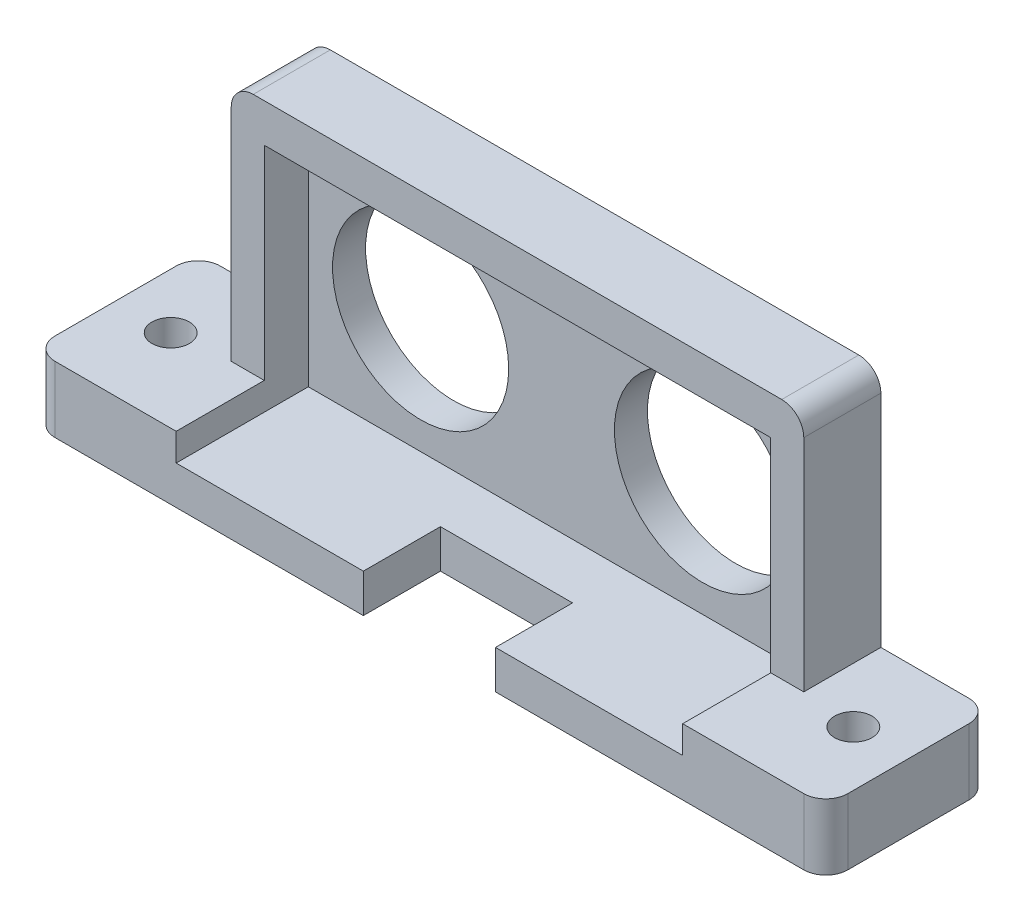
ISO-10303-21;
HEADER;
FILE_DESCRIPTION(('STEP AP214'),'2;1');
FILE_NAME('part.step','',(''),(''),'','','');
FILE_SCHEMA(('AUTOMOTIVE_DESIGN { 1 0 10303 214 1 1 1 1 }'));
ENDSEC;
DATA;
#1=APPLICATION_CONTEXT('core data for automotive mechanical design processes');
#2=APPLICATION_PROTOCOL_DEFINITION('international standard','automotive_design',2000,#1);
#3=PRODUCT_CONTEXT('',#1,'mechanical');
#4=PRODUCT('Part','Part','',(#3));
#5=PRODUCT_RELATED_PRODUCT_CATEGORY('part','',(#4));
#6=PRODUCT_DEFINITION_FORMATION('','',#4);
#7=PRODUCT_DEFINITION_CONTEXT('part definition',#1,'design');
#8=PRODUCT_DEFINITION('design','',#6,#7);
#9=PRODUCT_DEFINITION_SHAPE('','',#8);
#10=(LENGTH_UNIT() NAMED_UNIT(*) SI_UNIT(.MILLI.,.METRE.));
#11=(NAMED_UNIT(*) PLANE_ANGLE_UNIT() SI_UNIT($,.RADIAN.));
#12=(NAMED_UNIT(*) SI_UNIT($,.STERADIAN.) SOLID_ANGLE_UNIT());
#13=UNCERTAINTY_MEASURE_WITH_UNIT(LENGTH_MEASURE(1.E-05),#10,'distance_accuracy_value','');
#14=(GEOMETRIC_REPRESENTATION_CONTEXT(3) GLOBAL_UNCERTAINTY_ASSIGNED_CONTEXT((#13)) GLOBAL_UNIT_ASSIGNED_CONTEXT((#10,
#11,#12)) REPRESENTATION_CONTEXT('',''));
#15=CARTESIAN_POINT('',(0.,0.,0.));
#16=DIRECTION('',(0.,0.,1.));
#17=DIRECTION('',(1.,0.,0.));
#18=AXIS2_PLACEMENT_3D('',#15,#16,#17);
#19=CARTESIAN_POINT('',(0.,0.,15.));
#20=DIRECTION('',(0.,0.,-1.));
#21=DIRECTION('',(-1.,0.,0.));
#22=AXIS2_PLACEMENT_3D('',#19,#20,#21);
#23=PLANE('',#22);
#24=DIRECTION('',(0.,-1.,0.));
#25=VECTOR('',#24,1.);
#26=CARTESIAN_POINT('',(-23.,24.5,15.));
#27=LINE('',#26,#25);
#28=CARTESIAN_POINT('',(-23.,6.,15.));
#29=VERTEX_POINT('',#28);
#30=CARTESIAN_POINT('',(-23.,3.5,15.));
#31=VERTEX_POINT('',#30);
#32=EDGE_CURVE('E415',#29,#31,#27,.T.);
#33=ORIENTED_EDGE('',*,*,#32,.F.);
#34=DIRECTION('',(-1.,0.,0.));
#35=VECTOR('',#34,1.);
#36=CARTESIAN_POINT('',(-36.,6.,15.));
#37=LINE('',#36,#35);
#38=CARTESIAN_POINT('',(-34.,6.,15.));
#39=VERTEX_POINT('',#38);
#40=EDGE_CURVE('E352',#29,#39,#37,.T.);
#41=ORIENTED_EDGE('',*,*,#40,.T.);
#42=DIRECTION('',(0.,-1.,0.));
#43=VECTOR('',#42,1.);
#44=CARTESIAN_POINT('',(-34.,0.,15.));
#45=LINE('',#44,#43);
#46=CARTESIAN_POINT('',(-34.,0.,15.));
#47=VERTEX_POINT('',#46);
#48=EDGE_CURVE('E298',#39,#47,#45,.T.);
#49=ORIENTED_EDGE('',*,*,#48,.T.);
#50=DIRECTION('',(1.,0.,0.));
#51=VECTOR('',#50,1.);
#52=CARTESIAN_POINT('',(36.,0.,15.));
#53=LINE('',#52,#51);
#54=CARTESIAN_POINT('',(-6.,0.,15.));
#55=VERTEX_POINT('',#54);
#56=EDGE_CURVE('E364',#47,#55,#53,.T.);
#57=ORIENTED_EDGE('',*,*,#56,.T.);
#58=DIRECTION('',(0.,-1.,0.));
#59=VECTOR('',#58,1.);
#60=CARTESIAN_POINT('',(-6.00000000000001,41.8924439894498,15.));
#61=LINE('',#60,#59);
#62=CARTESIAN_POINT('',(-6.,3.5,15.));
#63=VERTEX_POINT('',#62);
#64=EDGE_CURVE('E445',#63,#55,#61,.T.);
#65=ORIENTED_EDGE('',*,*,#64,.F.);
#66=DIRECTION('',(1.,0.,0.));
#67=VECTOR('',#66,1.);
#68=CARTESIAN_POINT('',(-23.,3.5,15.));
#69=LINE('',#68,#67);
#70=EDGE_CURVE('E408',#31,#63,#69,.T.);
#71=ORIENTED_EDGE('',*,*,#70,.F.);
#72=EDGE_LOOP('',(#33,#41,#49,#57,#65,#71));
#73=FACE_BOUND('',#72,.T.);
#74=ADVANCED_FACE('F40',(#73),#23,.F.);
#75=CARTESIAN_POINT('',(-36.,0.,15.));
#76=DIRECTION('',(1.,0.,0.));
#77=DIRECTION('',(0.,0.,-1.));
#78=AXIS2_PLACEMENT_3D('',#75,#76,#77);
#79=PLANE('',#78);
#80=DIRECTION('',(0.,0.,-1.));
#81=VECTOR('',#80,1.);
#82=CARTESIAN_POINT('',(-36.,6.,15.));
#83=LINE('',#82,#81);
#84=CARTESIAN_POINT('',(-36.,6.,13.));
#85=VERTEX_POINT('',#84);
#86=CARTESIAN_POINT('',(-36.,6.,2.));
#87=VERTEX_POINT('',#86);
#88=EDGE_CURVE('E235',#85,#87,#83,.T.);
#89=ORIENTED_EDGE('',*,*,#88,.T.);
#90=DIRECTION('',(0.,-1.,0.));
#91=VECTOR('',#90,1.);
#92=CARTESIAN_POINT('',(-36.,0.,2.));
#93=LINE('',#92,#91);
#94=CARTESIAN_POINT('',(-36.,0.,2.));
#95=VERTEX_POINT('',#94);
#96=EDGE_CURVE('E249',#87,#95,#93,.T.);
#97=ORIENTED_EDGE('',*,*,#96,.T.);
#98=DIRECTION('',(0.,0.,-1.));
#99=VECTOR('',#98,1.);
#100=CARTESIAN_POINT('',(-36.,0.,15.));
#101=LINE('',#100,#99);
#102=CARTESIAN_POINT('',(-36.,0.,13.));
#103=VERTEX_POINT('',#102);
#104=EDGE_CURVE('E242',#103,#95,#101,.T.);
#105=ORIENTED_EDGE('',*,*,#104,.F.);
#106=DIRECTION('',(0.,-1.,0.));
#107=VECTOR('',#106,1.);
#108=CARTESIAN_POINT('',(-36.,0.,13.));
#109=LINE('',#108,#107);
#110=EDGE_CURVE('E246',#103,#85,#109,.F.);
#111=ORIENTED_EDGE('',*,*,#110,.T.);
#112=EDGE_LOOP('',(#89,#97,#105,#111));
#113=FACE_BOUND('',#112,.T.);
#114=ADVANCED_FACE('F535',(#113),#79,.F.);
#115=CARTESIAN_POINT('',(36.,0.,15.));
#116=DIRECTION('',(0.,1.,0.));
#117=DIRECTION('',(-1.,0.,0.));
#118=AXIS2_PLACEMENT_3D('',#115,#116,#117);
#119=PLANE('',#118);
#120=CARTESIAN_POINT('',(-31.,0.,7.50000000000001));
#121=DIRECTION('',(0.,1.,0.));
#122=DIRECTION('',(0.,0.,1.));
#123=AXIS2_PLACEMENT_3D('',#120,#121,#122);
#124=CIRCLE('',#123,1.69999999999999);
#125=CARTESIAN_POINT('',(-31.,0.,9.19999999999999));
#126=VERTEX_POINT('',#125);
#127=EDGE_CURVE('E478',#126,#126,#124,.T.);
#128=ORIENTED_EDGE('',*,*,#127,.T.);
#129=EDGE_LOOP('',(#128));
#130=FACE_BOUND('',#129,.T.);
#131=CARTESIAN_POINT('',(31.,0.,7.50000000000001));
#132=DIRECTION('',(0.,1.,0.));
#133=DIRECTION('',(0.,0.,1.));
#134=AXIS2_PLACEMENT_3D('',#131,#132,#133);
#135=CIRCLE('',#134,1.69999999999999);
#136=CARTESIAN_POINT('',(31.,0.,9.2));
#137=VERTEX_POINT('',#136);
#138=EDGE_CURVE('E470',#137,#137,#135,.T.);
#139=ORIENTED_EDGE('',*,*,#138,.T.);
#140=EDGE_LOOP('',(#139));
#141=FACE_BOUND('',#140,.T.);
#142=ORIENTED_EDGE('',*,*,#104,.T.);
#143=CARTESIAN_POINT('',(-34.,0.,2.));
#144=DIRECTION('',(0.,1.,0.));
#145=DIRECTION('',(-1.,0.,0.));
#146=AXIS2_PLACEMENT_3D('',#143,#144,#145);
#147=CIRCLE('',#146,2.);
#148=CARTESIAN_POINT('',(-34.,0.,0.));
#149=VERTEX_POINT('',#148);
#150=EDGE_CURVE('E262',#95,#149,#147,.F.);
#151=ORIENTED_EDGE('',*,*,#150,.T.);
#152=DIRECTION('',(1.,0.,0.));
#153=VECTOR('',#152,1.);
#154=CARTESIAN_POINT('',(36.,0.,0.));
#155=LINE('',#154,#153);
#156=CARTESIAN_POINT('',(34.,0.,0.));
#157=VERTEX_POINT('',#156);
#158=EDGE_CURVE('E368',#149,#157,#155,.T.);
#159=ORIENTED_EDGE('',*,*,#158,.T.);
#160=CARTESIAN_POINT('',(34.,0.,2.));
#161=DIRECTION('',(0.,1.,0.));
#162=DIRECTION('',(-1.,0.,0.));
#163=AXIS2_PLACEMENT_3D('',#160,#161,#162);
#164=CIRCLE('',#163,2.);
#165=CARTESIAN_POINT('',(36.,0.,2.));
#166=VERTEX_POINT('',#165);
#167=EDGE_CURVE('E259',#157,#166,#164,.F.);
#168=ORIENTED_EDGE('',*,*,#167,.T.);
#169=DIRECTION('',(0.,0.,-1.));
#170=VECTOR('',#169,1.);
#171=CARTESIAN_POINT('',(36.,0.,15.));
#172=LINE('',#171,#170);
#173=CARTESIAN_POINT('',(36.,0.,13.));
#174=VERTEX_POINT('',#173);
#175=EDGE_CURVE('E233',#174,#166,#172,.T.);
#176=ORIENTED_EDGE('',*,*,#175,.F.);
#177=CARTESIAN_POINT('',(34.,0.,13.));
#178=DIRECTION('',(0.,1.,0.));
#179=DIRECTION('',(-1.,0.,0.));
#180=AXIS2_PLACEMENT_3D('',#177,#178,#179);
#181=CIRCLE('',#180,2.);
#182=CARTESIAN_POINT('',(34.,0.,15.));
#183=VERTEX_POINT('',#182);
#184=EDGE_CURVE('E256',#174,#183,#181,.F.);
#185=ORIENTED_EDGE('',*,*,#184,.T.);
#186=CARTESIAN_POINT('',(6.,0.,15.));
#187=VERTEX_POINT('',#186);
#188=EDGE_CURVE('E349',#187,#183,#53,.T.);
#189=ORIENTED_EDGE('',*,*,#188,.F.);
#190=DIRECTION('',(0.,0.,1.));
#191=VECTOR('',#190,1.);
#192=CARTESIAN_POINT('',(6.,0.,15.));
#193=LINE('',#192,#191);
#194=CARTESIAN_POINT('',(6.,0.,8.));
#195=VERTEX_POINT('',#194);
#196=EDGE_CURVE('E459',#195,#187,#193,.T.);
#197=ORIENTED_EDGE('',*,*,#196,.F.);
#198=DIRECTION('',(1.,0.,0.));
#199=VECTOR('',#198,1.);
#200=CARTESIAN_POINT('',(-6.,0.,8.));
#201=LINE('',#200,#199);
#202=CARTESIAN_POINT('',(-6.,0.,8.));
#203=VERTEX_POINT('',#202);
#204=EDGE_CURVE('E462',#203,#195,#201,.T.);
#205=ORIENTED_EDGE('',*,*,#204,.F.);
#206=DIRECTION('',(0.,0.,-1.));
#207=VECTOR('',#206,1.);
#208=CARTESIAN_POINT('',(-6.,0.,15.));
#209=LINE('',#208,#207);
#210=EDGE_CURVE('E466',#55,#203,#209,.T.);
#211=ORIENTED_EDGE('',*,*,#210,.F.);
#212=ORIENTED_EDGE('',*,*,#56,.F.);
#213=CARTESIAN_POINT('',(-34.,0.,13.));
#214=DIRECTION('',(0.,1.,0.));
#215=DIRECTION('',(-1.,0.,0.));
#216=AXIS2_PLACEMENT_3D('',#213,#214,#215);
#217=CIRCLE('',#216,2.);
#218=EDGE_CURVE('E253',#47,#103,#217,.F.);
#219=ORIENTED_EDGE('',*,*,#218,.T.);
#220=EDGE_LOOP('',(#142,#151,#159,#168,#176,#185,#189,#197,#205,#211,#212,#219));
#221=FACE_BOUND('',#220,.T.);
#222=ADVANCED_FACE('F521',(#130,#141,#221),#119,.F.);
#223=CARTESIAN_POINT('',(36.,6.00000000000001,15.));
#224=DIRECTION('',(-1.,0.,0.));
#225=DIRECTION('',(0.,0.,1.));
#226=AXIS2_PLACEMENT_3D('',#223,#224,#225);
#227=PLANE('',#226);
#228=ORIENTED_EDGE('',*,*,#175,.T.);
#229=DIRECTION('',(0.,1.,0.));
#230=VECTOR('',#229,1.);
#231=CARTESIAN_POINT('',(36.,6.00000000000001,2.));
#232=LINE('',#231,#230);
#233=CARTESIAN_POINT('',(36.,6.00000000000001,2.));
#234=VERTEX_POINT('',#233);
#235=EDGE_CURVE('E286',#166,#234,#232,.T.);
#236=ORIENTED_EDGE('',*,*,#235,.T.);
#237=DIRECTION('',(0.,0.,-1.));
#238=VECTOR('',#237,1.);
#239=CARTESIAN_POINT('',(36.,6.00000000000001,15.));
#240=LINE('',#239,#238);
#241=CARTESIAN_POINT('',(36.,6.00000000000001,13.));
#242=VERTEX_POINT('',#241);
#243=EDGE_CURVE('E228',#242,#234,#240,.T.);
#244=ORIENTED_EDGE('',*,*,#243,.F.);
#245=DIRECTION('',(0.,1.,0.));
#246=VECTOR('',#245,1.);
#247=CARTESIAN_POINT('',(36.,6.00000000000001,13.));
#248=LINE('',#247,#246);
#249=EDGE_CURVE('E283',#242,#174,#248,.F.);
#250=ORIENTED_EDGE('',*,*,#249,.T.);
#251=EDGE_LOOP('',(#228,#236,#244,#250));
#252=FACE_BOUND('',#251,.T.);
#253=ADVANCED_FACE('F525',(#252),#227,.F.);
#254=CARTESIAN_POINT('',(26.,6.00000000000001,15.));
#255=DIRECTION('',(0.,-1.,0.));
#256=DIRECTION('',(1.,0.,0.));
#257=AXIS2_PLACEMENT_3D('',#254,#255,#256);
#258=PLANE('',#257);
#259=CARTESIAN_POINT('',(31.,6.00000000000001,7.50000000000001));
#260=DIRECTION('',(0.,1.,0.));
#261=DIRECTION('',(0.,0.,1.));
#262=AXIS2_PLACEMENT_3D('',#259,#260,#261);
#263=CIRCLE('',#262,1.69999999999999);
#264=CARTESIAN_POINT('',(31.,6.00000000000001,9.2));
#265=VERTEX_POINT('',#264);
#266=EDGE_CURVE('E474',#265,#265,#263,.T.);
#267=ORIENTED_EDGE('',*,*,#266,.F.);
#268=EDGE_LOOP('',(#267));
#269=FACE_BOUND('',#268,.T.);
#270=ORIENTED_EDGE('',*,*,#243,.T.);
#271=CARTESIAN_POINT('',(34.,6.00000000000001,2.));
#272=DIRECTION('',(0.,-1.,0.));
#273=DIRECTION('',(1.,0.,0.));
#274=AXIS2_PLACEMENT_3D('',#271,#272,#273);
#275=CIRCLE('',#274,2.);
#276=CARTESIAN_POINT('',(34.,6.00000000000001,0.));
#277=VERTEX_POINT('',#276);
#278=EDGE_CURVE('E292',#234,#277,#275,.F.);
#279=ORIENTED_EDGE('',*,*,#278,.T.);
#280=DIRECTION('',(-1.,0.,0.));
#281=VECTOR('',#280,1.);
#282=CARTESIAN_POINT('',(26.,6.00000000000001,0.));
#283=LINE('',#282,#281);
#284=CARTESIAN_POINT('',(26.,6.00000000000001,0.));
#285=VERTEX_POINT('',#284);
#286=EDGE_CURVE('E225',#277,#285,#283,.T.);
#287=ORIENTED_EDGE('',*,*,#286,.T.);
#288=DIRECTION('',(0.,0.,-1.));
#289=VECTOR('',#288,1.);
#290=CARTESIAN_POINT('',(26.,6.00000000000001,15.));
#291=LINE('',#290,#289);
#292=CARTESIAN_POINT('',(26.,6.00000000000001,7.));
#293=VERTEX_POINT('',#292);
#294=EDGE_CURVE('E216',#293,#285,#291,.T.);
#295=ORIENTED_EDGE('',*,*,#294,.F.);
#296=DIRECTION('',(1.,0.,0.));
#297=VECTOR('',#296,1.);
#298=CARTESIAN_POINT('',(-52.2488094968134,6.,7.));
#299=LINE('',#298,#297);
#300=CARTESIAN_POINT('',(23.,6.00000000000001,7.));
#301=VERTEX_POINT('',#300);
#302=EDGE_CURVE('E201',#301,#293,#299,.T.);
#303=ORIENTED_EDGE('',*,*,#302,.F.);
#304=DIRECTION('',(0.,0.,-1.));
#305=VECTOR('',#304,1.);
#306=CARTESIAN_POINT('',(23.,6.00000000000001,-50.5667875190821));
#307=LINE('',#306,#305);
#308=CARTESIAN_POINT('',(23.,6.00000000000001,15.));
#309=VERTEX_POINT('',#308);
#310=EDGE_CURVE('E486',#309,#301,#307,.T.);
#311=ORIENTED_EDGE('',*,*,#310,.F.);
#312=DIRECTION('',(-1.,0.,0.));
#313=VECTOR('',#312,1.);
#314=CARTESIAN_POINT('',(26.,6.00000000000001,15.));
#315=LINE('',#314,#313);
#316=CARTESIAN_POINT('',(34.,6.00000000000001,15.));
#317=VERTEX_POINT('',#316);
#318=EDGE_CURVE('E358',#317,#309,#315,.T.);
#319=ORIENTED_EDGE('',*,*,#318,.F.);
#320=CARTESIAN_POINT('',(34.,6.00000000000001,13.));
#321=DIRECTION('',(0.,-1.,0.));
#322=DIRECTION('',(1.,0.,0.));
#323=AXIS2_PLACEMENT_3D('',#320,#321,#322);
#324=CIRCLE('',#323,2.);
#325=EDGE_CURVE('E64',#317,#242,#324,.F.);
#326=ORIENTED_EDGE('',*,*,#325,.T.);
#327=EDGE_LOOP('',(#270,#279,#287,#295,#303,#311,#319,#326));
#328=FACE_BOUND('',#327,.T.);
#329=ADVANCED_FACE('F223',(#269,#328),#258,.F.);
#330=CARTESIAN_POINT('',(26.,28.,15.));
#331=DIRECTION('',(-1.,0.,0.));
#332=DIRECTION('',(0.,-1.,0.));
#333=AXIS2_PLACEMENT_3D('',#330,#331,#332);
#334=PLANE('',#333);
#335=DIRECTION('',(0.,0.,-1.));
#336=VECTOR('',#335,1.);
#337=CARTESIAN_POINT('',(26.,26.,15.));
#338=LINE('',#337,#336);
#339=CARTESIAN_POINT('',(26.,26.,0.));
#340=VERTEX_POINT('',#339);
#341=CARTESIAN_POINT('',(26.,26.,7.));
#342=VERTEX_POINT('',#341);
#343=EDGE_CURVE('E219',#340,#342,#338,.F.);
#344=ORIENTED_EDGE('',*,*,#343,.T.);
#345=DIRECTION('',(0.,1.,0.));
#346=VECTOR('',#345,1.);
#347=CARTESIAN_POINT('',(26.,6.00000000000001,7.));
#348=LINE('',#347,#346);
#349=EDGE_CURVE('E56',#293,#342,#348,.T.);
#350=ORIENTED_EDGE('',*,*,#349,.F.);
#351=ORIENTED_EDGE('',*,*,#294,.T.);
#352=DIRECTION('',(0.,1.,0.));
#353=VECTOR('',#352,1.);
#354=CARTESIAN_POINT('',(26.,28.,0.));
#355=LINE('',#354,#353);
#356=EDGE_CURVE('E337',#285,#340,#355,.T.);
#357=ORIENTED_EDGE('',*,*,#356,.T.);
#358=EDGE_LOOP('',(#344,#350,#351,#357));
#359=FACE_BOUND('',#358,.T.);
#360=ADVANCED_FACE('F214',(#359),#334,.F.);
#361=CARTESIAN_POINT('',(-26.,28.,15.));
#362=DIRECTION('',(0.,-1.,0.));
#363=DIRECTION('',(1.,0.,0.));
#364=AXIS2_PLACEMENT_3D('',#361,#362,#363);
#365=PLANE('',#364);
#366=DIRECTION('',(0.,0.,-1.));
#367=VECTOR('',#366,1.);
#368=CARTESIAN_POINT('',(-24.,28.,15.));
#369=LINE('',#368,#367);
#370=CARTESIAN_POINT('',(-24.,28.,0.));
#371=VERTEX_POINT('',#370);
#372=CARTESIAN_POINT('',(-24.,28.,7.));
#373=VERTEX_POINT('',#372);
#374=EDGE_CURVE('E308',#371,#373,#369,.F.);
#375=ORIENTED_EDGE('',*,*,#374,.T.);
#376=DIRECTION('',(1.,0.,0.));
#377=VECTOR('',#376,1.);
#378=CARTESIAN_POINT('',(-26.,28.,7.));
#379=LINE('',#378,#377);
#380=CARTESIAN_POINT('',(24.,28.,7.));
#381=VERTEX_POINT('',#380);
#382=EDGE_CURVE('E315',#373,#381,#379,.T.);
#383=ORIENTED_EDGE('',*,*,#382,.T.);
#384=DIRECTION('',(0.,0.,-1.));
#385=VECTOR('',#384,1.);
#386=CARTESIAN_POINT('',(24.,28.,15.));
#387=LINE('',#386,#385);
#388=CARTESIAN_POINT('',(24.,28.,0.));
#389=VERTEX_POINT('',#388);
#390=EDGE_CURVE('E305',#381,#389,#387,.T.);
#391=ORIENTED_EDGE('',*,*,#390,.T.);
#392=DIRECTION('',(-1.,0.,0.));
#393=VECTOR('',#392,1.);
#394=CARTESIAN_POINT('',(-26.,28.,0.));
#395=LINE('',#394,#393);
#396=EDGE_CURVE('E330',#389,#371,#395,.T.);
#397=ORIENTED_EDGE('',*,*,#396,.T.);
#398=EDGE_LOOP('',(#375,#383,#391,#397));
#399=FACE_BOUND('',#398,.T.);
#400=ADVANCED_FACE('F320',(#399),#365,.F.);
#401=CARTESIAN_POINT('',(-26.,6.,15.));
#402=DIRECTION('',(1.,0.,0.));
#403=DIRECTION('',(0.,0.,-1.));
#404=AXIS2_PLACEMENT_3D('',#401,#402,#403);
#405=PLANE('',#404);
#406=DIRECTION('',(0.,0.,-1.));
#407=VECTOR('',#406,1.);
#408=CARTESIAN_POINT('',(-26.,6.,15.));
#409=LINE('',#408,#407);
#410=CARTESIAN_POINT('',(-26.,6.,7.));
#411=VERTEX_POINT('',#410);
#412=CARTESIAN_POINT('',(-26.,6.,0.));
#413=VERTEX_POINT('',#412);
#414=EDGE_CURVE('E229',#411,#413,#409,.T.);
#415=ORIENTED_EDGE('',*,*,#414,.F.);
#416=DIRECTION('',(0.,-1.,0.));
#417=VECTOR('',#416,1.);
#418=CARTESIAN_POINT('',(-26.,6.,7.));
#419=LINE('',#418,#417);
#420=CARTESIAN_POINT('',(-26.,26.,7.));
#421=VERTEX_POINT('',#420);
#422=EDGE_CURVE('E326',#421,#411,#419,.T.);
#423=ORIENTED_EDGE('',*,*,#422,.F.);
#424=DIRECTION('',(0.,0.,-1.));
#425=VECTOR('',#424,1.);
#426=CARTESIAN_POINT('',(-26.,26.,15.));
#427=LINE('',#426,#425);
#428=CARTESIAN_POINT('',(-26.,26.,0.));
#429=VERTEX_POINT('',#428);
#430=EDGE_CURVE('E302',#421,#429,#427,.T.);
#431=ORIENTED_EDGE('',*,*,#430,.T.);
#432=DIRECTION('',(0.,-1.,0.));
#433=VECTOR('',#432,1.);
#434=CARTESIAN_POINT('',(-26.,6.,0.));
#435=LINE('',#434,#433);
#436=EDGE_CURVE('E336',#429,#413,#435,.T.);
#437=ORIENTED_EDGE('',*,*,#436,.T.);
#438=EDGE_LOOP('',(#415,#423,#431,#437));
#439=FACE_BOUND('',#438,.T.);
#440=ADVANCED_FACE('F545',(#439),#405,.F.);
#441=CARTESIAN_POINT('',(-36.,6.,15.));
#442=DIRECTION('',(0.,-1.,0.));
#443=DIRECTION('',(0.,0.,-1.));
#444=AXIS2_PLACEMENT_3D('',#441,#442,#443);
#445=PLANE('',#444);
#446=CARTESIAN_POINT('',(-31.,6.00000000000001,7.50000000000001));
#447=DIRECTION('',(0.,1.,0.));
#448=DIRECTION('',(0.,0.,1.));
#449=AXIS2_PLACEMENT_3D('',#446,#447,#448);
#450=CIRCLE('',#449,1.69999999999999);
#451=CARTESIAN_POINT('',(-31.,6.00000000000001,9.2));
#452=VERTEX_POINT('',#451);
#453=EDGE_CURVE('E482',#452,#452,#450,.T.);
#454=ORIENTED_EDGE('',*,*,#453,.F.);
#455=EDGE_LOOP('',(#454));
#456=FACE_BOUND('',#455,.T.);
#457=DIRECTION('',(-1.,0.,0.));
#458=VECTOR('',#457,1.);
#459=CARTESIAN_POINT('',(-36.,6.,0.));
#460=LINE('',#459,#458);
#461=CARTESIAN_POINT('',(-34.,6.,0.));
#462=VERTEX_POINT('',#461);
#463=EDGE_CURVE('E342',#413,#462,#460,.T.);
#464=ORIENTED_EDGE('',*,*,#463,.T.);
#465=CARTESIAN_POINT('',(-34.,6.,2.));
#466=DIRECTION('',(0.,-1.,0.));
#467=DIRECTION('',(0.,0.,-1.));
#468=AXIS2_PLACEMENT_3D('',#465,#466,#467);
#469=CIRCLE('',#468,2.);
#470=EDGE_CURVE('E280',#462,#87,#469,.F.);
#471=ORIENTED_EDGE('',*,*,#470,.T.);
#472=ORIENTED_EDGE('',*,*,#88,.F.);
#473=CARTESIAN_POINT('',(-34.,6.,13.));
#474=DIRECTION('',(0.,-1.,0.));
#475=DIRECTION('',(0.,0.,-1.));
#476=AXIS2_PLACEMENT_3D('',#473,#474,#475);
#477=CIRCLE('',#476,2.);
#478=EDGE_CURVE('E277',#85,#39,#477,.F.);
#479=ORIENTED_EDGE('',*,*,#478,.T.);
#480=ORIENTED_EDGE('',*,*,#40,.F.);
#481=DIRECTION('',(0.,0.,1.));
#482=VECTOR('',#481,1.);
#483=CARTESIAN_POINT('',(-23.,6.,-50.5667875190821));
#484=LINE('',#483,#482);
#485=CARTESIAN_POINT('',(-23.,6.,7.));
#486=VERTEX_POINT('',#485);
#487=EDGE_CURVE('E12',#486,#29,#484,.T.);
#488=ORIENTED_EDGE('',*,*,#487,.F.);
#489=EDGE_CURVE('E210',#411,#486,#299,.T.);
#490=ORIENTED_EDGE('',*,*,#489,.F.);
#491=ORIENTED_EDGE('',*,*,#414,.T.);
#492=EDGE_LOOP('',(#464,#471,#472,#479,#480,#488,#490,#491));
#493=FACE_BOUND('',#492,.T.);
#494=ADVANCED_FACE('F541',(#456,#493),#445,.F.);
#495=ORIENTED_EDGE('',*,*,#318,.T.);
#496=DIRECTION('',(0.,1.,0.));
#497=VECTOR('',#496,1.);
#498=CARTESIAN_POINT('',(23.,24.5,15.));
#499=LINE('',#498,#497);
#500=CARTESIAN_POINT('',(23.,3.5,15.));
#501=VERTEX_POINT('',#500);
#502=EDGE_CURVE('E404',#501,#309,#499,.T.);
#503=ORIENTED_EDGE('',*,*,#502,.F.);
#504=CARTESIAN_POINT('',(6.,3.5,15.));
#505=VERTEX_POINT('',#504);
#506=EDGE_CURVE('E412',#505,#501,#69,.T.);
#507=ORIENTED_EDGE('',*,*,#506,.F.);
#508=DIRECTION('',(0.,-1.,0.));
#509=VECTOR('',#508,1.);
#510=CARTESIAN_POINT('',(5.99999999999999,41.8924439894498,15.));
#511=LINE('',#510,#509);
#512=EDGE_CURVE('E449',#505,#187,#511,.T.);
#513=ORIENTED_EDGE('',*,*,#512,.T.);
#514=ORIENTED_EDGE('',*,*,#188,.T.);
#515=DIRECTION('',(0.,1.,0.));
#516=VECTOR('',#515,1.);
#517=CARTESIAN_POINT('',(34.,0.,15.));
#518=LINE('',#517,#516);
#519=EDGE_CURVE('E295',#183,#317,#518,.T.);
#520=ORIENTED_EDGE('',*,*,#519,.T.);
#521=EDGE_LOOP('',(#495,#503,#507,#513,#514,#520));
#522=FACE_BOUND('',#521,.T.);
#523=ADVANCED_FACE('F513',(#522),#23,.F.);
#524=CARTESIAN_POINT('',(0.,0.,0.));
#525=DIRECTION('',(0.,0.,-1.));
#526=DIRECTION('',(-1.,0.,0.));
#527=AXIS2_PLACEMENT_3D('',#524,#525,#526);
#528=PLANE('',#527);
#529=CARTESIAN_POINT('',(-12.8,14.,0.));
#530=DIRECTION('',(0.,0.,1.));
#531=DIRECTION('',(1.,0.,0.));
#532=AXIS2_PLACEMENT_3D('',#529,#530,#531);
#533=CIRCLE('',#532,8.);
#534=CARTESIAN_POINT('',(-4.8,14.,0.));
#535=VERTEX_POINT('',#534);
#536=EDGE_CURVE('E417',#535,#535,#533,.T.);
#537=ORIENTED_EDGE('',*,*,#536,.T.);
#538=EDGE_LOOP('',(#537));
#539=FACE_BOUND('',#538,.T.);
#540=CARTESIAN_POINT('',(12.8,14.,0.));
#541=DIRECTION('',(0.,0.,1.));
#542=DIRECTION('',(1.,0.,0.));
#543=AXIS2_PLACEMENT_3D('',#540,#541,#542);
#544=CIRCLE('',#543,8.00000000000001);
#545=CARTESIAN_POINT('',(20.8,14.,0.));
#546=VERTEX_POINT('',#545);
#547=EDGE_CURVE('E425',#546,#546,#544,.T.);
#548=ORIENTED_EDGE('',*,*,#547,.T.);
#549=EDGE_LOOP('',(#548));
#550=FACE_BOUND('',#549,.T.);
#551=ORIENTED_EDGE('',*,*,#158,.F.);
#552=DIRECTION('',(0.,-1.,0.));
#553=VECTOR('',#552,1.);
#554=CARTESIAN_POINT('',(-34.,6.,0.));
#555=LINE('',#554,#553);
#556=EDGE_CURVE('E274',#149,#462,#555,.F.);
#557=ORIENTED_EDGE('',*,*,#556,.T.);
#558=ORIENTED_EDGE('',*,*,#463,.F.);
#559=ORIENTED_EDGE('',*,*,#436,.F.);
#560=CARTESIAN_POINT('',(-24.,26.,0.));
#561=DIRECTION('',(0.,0.,-1.));
#562=DIRECTION('',(-1.,0.,0.));
#563=AXIS2_PLACEMENT_3D('',#560,#561,#562);
#564=CIRCLE('',#563,2.);
#565=EDGE_CURVE('E268',#429,#371,#564,.T.);
#566=ORIENTED_EDGE('',*,*,#565,.T.);
#567=ORIENTED_EDGE('',*,*,#396,.F.);
#568=CARTESIAN_POINT('',(24.,26.,0.));
#569=DIRECTION('',(0.,0.,-1.));
#570=DIRECTION('',(-1.,0.,0.));
#571=AXIS2_PLACEMENT_3D('',#568,#569,#570);
#572=CIRCLE('',#571,2.);
#573=EDGE_CURVE('E265',#389,#340,#572,.T.);
#574=ORIENTED_EDGE('',*,*,#573,.T.);
#575=ORIENTED_EDGE('',*,*,#356,.F.);
#576=ORIENTED_EDGE('',*,*,#286,.F.);
#577=DIRECTION('',(0.,1.,0.));
#578=VECTOR('',#577,1.);
#579=CARTESIAN_POINT('',(34.,0.,0.));
#580=LINE('',#579,#578);
#581=EDGE_CURVE('E271',#277,#157,#580,.F.);
#582=ORIENTED_EDGE('',*,*,#581,.T.);
#583=EDGE_LOOP('',(#551,#557,#558,#559,#566,#567,#574,#575,#576,#582));
#584=FACE_BOUND('',#583,.T.);
#585=ADVANCED_FACE('F332',(#539,#550,#584),#528,.T.);
#586=CARTESIAN_POINT('',(0.,0.,3.));
#587=DIRECTION('',(0.,0.,-1.));
#588=DIRECTION('',(-1.,0.,0.));
#589=AXIS2_PLACEMENT_3D('',#586,#587,#588);
#590=PLANE('',#589);
#591=CARTESIAN_POINT('',(-12.8,14.,3.));
#592=DIRECTION('',(0.,0.,1.));
#593=DIRECTION('',(1.,0.,0.));
#594=AXIS2_PLACEMENT_3D('',#591,#592,#593);
#595=CIRCLE('',#594,8.);
#596=CARTESIAN_POINT('',(-4.8,14.,3.));
#597=VERTEX_POINT('',#596);
#598=EDGE_CURVE('E421',#597,#597,#595,.T.);
#599=ORIENTED_EDGE('',*,*,#598,.F.);
#600=EDGE_LOOP('',(#599));
#601=FACE_BOUND('',#600,.T.);
#602=CARTESIAN_POINT('',(12.8,14.,3.));
#603=DIRECTION('',(0.,0.,1.));
#604=DIRECTION('',(1.,0.,0.));
#605=AXIS2_PLACEMENT_3D('',#602,#603,#604);
#606=CIRCLE('',#605,8.00000000000001);
#607=CARTESIAN_POINT('',(20.8,14.,3.));
#608=VERTEX_POINT('',#607);
#609=EDGE_CURVE('E429',#608,#608,#606,.T.);
#610=ORIENTED_EDGE('',*,*,#609,.F.);
#611=EDGE_LOOP('',(#610));
#612=FACE_BOUND('',#611,.T.);
#613=DIRECTION('',(0.,-1.,0.));
#614=VECTOR('',#613,1.);
#615=CARTESIAN_POINT('',(-23.,24.5,3.));
#616=LINE('',#615,#614);
#617=CARTESIAN_POINT('',(-23.,24.5,3.));
#618=VERTEX_POINT('',#617);
#619=CARTESIAN_POINT('',(-23.,3.5,3.));
#620=VERTEX_POINT('',#619);
#621=EDGE_CURVE('E376',#618,#620,#616,.T.);
#622=ORIENTED_EDGE('',*,*,#621,.T.);
#623=DIRECTION('',(1.,0.,0.));
#624=VECTOR('',#623,1.);
#625=CARTESIAN_POINT('',(-23.,3.5,3.));
#626=LINE('',#625,#624);
#627=CARTESIAN_POINT('',(23.,3.5,3.));
#628=VERTEX_POINT('',#627);
#629=EDGE_CURVE('E400',#620,#628,#626,.T.);
#630=ORIENTED_EDGE('',*,*,#629,.T.);
#631=DIRECTION('',(0.,1.,0.));
#632=VECTOR('',#631,1.);
#633=CARTESIAN_POINT('',(23.,24.5,3.));
#634=LINE('',#633,#632);
#635=CARTESIAN_POINT('',(23.,24.5,3.));
#636=VERTEX_POINT('',#635);
#637=EDGE_CURVE('E392',#628,#636,#634,.T.);
#638=ORIENTED_EDGE('',*,*,#637,.T.);
#639=DIRECTION('',(-1.,0.,0.));
#640=VECTOR('',#639,1.);
#641=CARTESIAN_POINT('',(-23.,24.5,3.));
#642=LINE('',#641,#640);
#643=EDGE_CURVE('E384',#636,#618,#642,.T.);
#644=ORIENTED_EDGE('',*,*,#643,.T.);
#645=EDGE_LOOP('',(#622,#630,#638,#644));
#646=FACE_BOUND('',#645,.T.);
#647=ADVANCED_FACE('F562',(#601,#612,#646),#590,.F.);
#648=CARTESIAN_POINT('',(-23.,3.5,-50.5667875190821));
#649=DIRECTION('',(0.,-1.,0.));
#650=DIRECTION('',(0.,0.,-1.));
#651=AXIS2_PLACEMENT_3D('',#648,#649,#650);
#652=PLANE('',#651);
#653=ORIENTED_EDGE('',*,*,#70,.T.);
#654=DIRECTION('',(0.,0.,-1.));
#655=VECTOR('',#654,1.);
#656=CARTESIAN_POINT('',(-5.99999999999999,3.5,-50.5667875190821));
#657=LINE('',#656,#655);
#658=CARTESIAN_POINT('',(-6.,3.5,8.));
#659=VERTEX_POINT('',#658);
#660=EDGE_CURVE('E433',#63,#659,#657,.T.);
#661=ORIENTED_EDGE('',*,*,#660,.T.);
#662=DIRECTION('',(1.,0.,0.));
#663=VECTOR('',#662,1.);
#664=CARTESIAN_POINT('',(-23.,3.5,8.));
#665=LINE('',#664,#663);
#666=CARTESIAN_POINT('',(6.,3.5,8.));
#667=VERTEX_POINT('',#666);
#668=EDGE_CURVE('E441',#659,#667,#665,.T.);
#669=ORIENTED_EDGE('',*,*,#668,.T.);
#670=DIRECTION('',(0.,0.,1.));
#671=VECTOR('',#670,1.);
#672=CARTESIAN_POINT('',(6.00000000000001,3.5,-50.5667875190821));
#673=LINE('',#672,#671);
#674=EDGE_CURVE('E437',#667,#505,#673,.T.);
#675=ORIENTED_EDGE('',*,*,#674,.T.);
#676=ORIENTED_EDGE('',*,*,#506,.T.);
#677=DIRECTION('',(0.,0.,1.));
#678=VECTOR('',#677,1.);
#679=CARTESIAN_POINT('',(23.,3.5,-50.5667875190821));
#680=LINE('',#679,#678);
#681=EDGE_CURVE('E396',#628,#501,#680,.T.);
#682=ORIENTED_EDGE('',*,*,#681,.F.);
#683=ORIENTED_EDGE('',*,*,#629,.F.);
#684=DIRECTION('',(0.,0.,1.));
#685=VECTOR('',#684,1.);
#686=CARTESIAN_POINT('',(-23.,3.5,-50.5667875190821));
#687=LINE('',#686,#685);
#688=EDGE_CURVE('E371',#620,#31,#687,.T.);
#689=ORIENTED_EDGE('',*,*,#688,.T.);
#690=EDGE_LOOP('',(#653,#661,#669,#675,#676,#682,#683,#689));
#691=FACE_BOUND('',#690,.T.);
#692=ADVANCED_FACE('F555',(#691),#652,.F.);
#693=CARTESIAN_POINT('',(23.,24.5,-50.5667875190821));
#694=DIRECTION('',(1.,0.,0.));
#695=DIRECTION('',(0.,1.,0.));
#696=AXIS2_PLACEMENT_3D('',#693,#694,#695);
#697=PLANE('',#696);
#698=ORIENTED_EDGE('',*,*,#310,.T.);
#699=DIRECTION('',(0.,1.,0.));
#700=VECTOR('',#699,1.);
#701=CARTESIAN_POINT('',(23.,24.5,7.));
#702=LINE('',#701,#700);
#703=CARTESIAN_POINT('',(23.,24.5,7.));
#704=VERTEX_POINT('',#703);
#705=EDGE_CURVE('E204',#301,#704,#702,.T.);
#706=ORIENTED_EDGE('',*,*,#705,.T.);
#707=DIRECTION('',(0.,0.,1.));
#708=VECTOR('',#707,1.);
#709=CARTESIAN_POINT('',(23.,24.5,-50.5667875190821));
#710=LINE('',#709,#708);
#711=EDGE_CURVE('E388',#636,#704,#710,.T.);
#712=ORIENTED_EDGE('',*,*,#711,.F.);
#713=ORIENTED_EDGE('',*,*,#637,.F.);
#714=ORIENTED_EDGE('',*,*,#681,.T.);
#715=ORIENTED_EDGE('',*,*,#502,.T.);
#716=EDGE_LOOP('',(#698,#706,#712,#713,#714,#715));
#717=FACE_BOUND('',#716,.T.);
#718=ADVANCED_FACE('F564',(#717),#697,.F.);
#719=CARTESIAN_POINT('',(-23.,24.5,-50.5667875190821));
#720=DIRECTION('',(0.,1.,0.));
#721=DIRECTION('',(0.,0.,1.));
#722=AXIS2_PLACEMENT_3D('',#719,#720,#721);
#723=PLANE('',#722);
#724=ORIENTED_EDGE('',*,*,#711,.T.);
#725=DIRECTION('',(-1.,0.,0.));
#726=VECTOR('',#725,1.);
#727=CARTESIAN_POINT('',(-23.,24.5,7.));
#728=LINE('',#727,#726);
#729=CARTESIAN_POINT('',(-23.,24.5,7.));
#730=VERTEX_POINT('',#729);
#731=EDGE_CURVE('E491',#704,#730,#728,.T.);
#732=ORIENTED_EDGE('',*,*,#731,.T.);
#733=DIRECTION('',(0.,0.,1.));
#734=VECTOR('',#733,1.);
#735=CARTESIAN_POINT('',(-23.,24.5,-50.5667875190821));
#736=LINE('',#735,#734);
#737=EDGE_CURVE('E380',#618,#730,#736,.T.);
#738=ORIENTED_EDGE('',*,*,#737,.F.);
#739=ORIENTED_EDGE('',*,*,#643,.F.);
#740=EDGE_LOOP('',(#724,#732,#738,#739));
#741=FACE_BOUND('',#740,.T.);
#742=ADVANCED_FACE('F560',(#741),#723,.F.);
#743=CARTESIAN_POINT('',(-23.,24.5,-50.5667875190821));
#744=DIRECTION('',(-1.,0.,0.));
#745=DIRECTION('',(0.,-1.,0.));
#746=AXIS2_PLACEMENT_3D('',#743,#744,#745);
#747=PLANE('',#746);
#748=ORIENTED_EDGE('',*,*,#737,.T.);
#749=DIRECTION('',(0.,-1.,0.));
#750=VECTOR('',#749,1.);
#751=CARTESIAN_POINT('',(-23.,24.5,7.));
#752=LINE('',#751,#750);
#753=EDGE_CURVE('E495',#730,#486,#752,.T.);
#754=ORIENTED_EDGE('',*,*,#753,.T.);
#755=ORIENTED_EDGE('',*,*,#487,.T.);
#756=ORIENTED_EDGE('',*,*,#32,.T.);
#757=ORIENTED_EDGE('',*,*,#688,.F.);
#758=ORIENTED_EDGE('',*,*,#621,.F.);
#759=EDGE_LOOP('',(#748,#754,#755,#756,#757,#758));
#760=FACE_BOUND('',#759,.T.);
#761=ADVANCED_FACE('F551',(#760),#747,.F.);
#762=CARTESIAN_POINT('',(12.8,14.,0.));
#763=DIRECTION('',(0.,0.,1.));
#764=DIRECTION('',(1.,0.,0.));
#765=AXIS2_PLACEMENT_3D('',#762,#763,#764);
#766=CYLINDRICAL_SURFACE('',#765,8.00000000000001);
#767=ORIENTED_EDGE('',*,*,#547,.F.);
#768=EDGE_LOOP('',(#767));
#769=FACE_BOUND('',#768,.T.);
#770=ORIENTED_EDGE('',*,*,#609,.T.);
#771=EDGE_LOOP('',(#770));
#772=FACE_BOUND('',#771,.T.);
#773=ADVANCED_FACE('F584',(#769,#772),#766,.F.);
#774=CARTESIAN_POINT('',(-12.8,14.,0.));
#775=DIRECTION('',(0.,0.,1.));
#776=DIRECTION('',(1.,0.,0.));
#777=AXIS2_PLACEMENT_3D('',#774,#775,#776);
#778=CYLINDRICAL_SURFACE('',#777,8.);
#779=ORIENTED_EDGE('',*,*,#536,.F.);
#780=EDGE_LOOP('',(#779));
#781=FACE_BOUND('',#780,.T.);
#782=ORIENTED_EDGE('',*,*,#598,.T.);
#783=EDGE_LOOP('',(#782));
#784=FACE_BOUND('',#783,.T.);
#785=ADVANCED_FACE('F577',(#781,#784),#778,.F.);
#786=CARTESIAN_POINT('',(-6.00000000000001,41.8924439894498,15.));
#787=DIRECTION('',(-1.,0.,0.));
#788=DIRECTION('',(0.,-1.,0.));
#789=AXIS2_PLACEMENT_3D('',#786,#787,#788);
#790=PLANE('',#789);
#791=ORIENTED_EDGE('',*,*,#64,.T.);
#792=ORIENTED_EDGE('',*,*,#210,.T.);
#793=DIRECTION('',(0.,-1.,0.));
#794=VECTOR('',#793,1.);
#795=CARTESIAN_POINT('',(-6.00000000000001,41.8924439894498,8.));
#796=LINE('',#795,#794);
#797=EDGE_CURVE('E456',#659,#203,#796,.T.);
#798=ORIENTED_EDGE('',*,*,#797,.F.);
#799=ORIENTED_EDGE('',*,*,#660,.F.);
#800=EDGE_LOOP('',(#791,#792,#798,#799));
#801=FACE_BOUND('',#800,.T.);
#802=ADVANCED_FACE('F575',(#801),#790,.F.);
#803=CARTESIAN_POINT('',(5.99999999999999,41.8924439894498,15.));
#804=DIRECTION('',(1.,0.,0.));
#805=DIRECTION('',(0.,1.,0.));
#806=AXIS2_PLACEMENT_3D('',#803,#804,#805);
#807=PLANE('',#806);
#808=DIRECTION('',(0.,-1.,0.));
#809=VECTOR('',#808,1.);
#810=CARTESIAN_POINT('',(5.99999999999999,41.8924439894498,8.));
#811=LINE('',#810,#809);
#812=EDGE_CURVE('E453',#667,#195,#811,.T.);
#813=ORIENTED_EDGE('',*,*,#812,.T.);
#814=ORIENTED_EDGE('',*,*,#196,.T.);
#815=ORIENTED_EDGE('',*,*,#512,.F.);
#816=ORIENTED_EDGE('',*,*,#674,.F.);
#817=EDGE_LOOP('',(#813,#814,#815,#816));
#818=FACE_BOUND('',#817,.T.);
#819=ADVANCED_FACE('F568',(#818),#807,.F.);
#820=CARTESIAN_POINT('',(-6.00000000000001,41.8924439894498,8.));
#821=DIRECTION('',(0.,0.,-1.));
#822=DIRECTION('',(-1.,0.,0.));
#823=AXIS2_PLACEMENT_3D('',#820,#821,#822);
#824=PLANE('',#823);
#825=ORIENTED_EDGE('',*,*,#797,.T.);
#826=ORIENTED_EDGE('',*,*,#204,.T.);
#827=ORIENTED_EDGE('',*,*,#812,.F.);
#828=ORIENTED_EDGE('',*,*,#668,.F.);
#829=EDGE_LOOP('',(#825,#826,#827,#828));
#830=FACE_BOUND('',#829,.T.);
#831=ADVANCED_FACE('F572',(#830),#824,.F.);
#832=CARTESIAN_POINT('',(-34.,0.,2.));
#833=DIRECTION('',(0.,1.,0.));
#834=DIRECTION('',(0.,0.,1.));
#835=AXIS2_PLACEMENT_3D('',#832,#833,#834);
#836=CYLINDRICAL_SURFACE('',#835,2.);
#837=ORIENTED_EDGE('',*,*,#470,.F.);
#838=ORIENTED_EDGE('',*,*,#556,.F.);
#839=ORIENTED_EDGE('',*,*,#150,.F.);
#840=ORIENTED_EDGE('',*,*,#96,.F.);
#841=EDGE_LOOP('',(#837,#838,#839,#840));
#842=FACE_BOUND('',#841,.T.);
#843=ADVANCED_FACE('F534',(#842),#836,.T.);
#844=CARTESIAN_POINT('',(34.,6.00000000000001,2.));
#845=DIRECTION('',(0.,-1.,0.));
#846=DIRECTION('',(0.,0.,-1.));
#847=AXIS2_PLACEMENT_3D('',#844,#845,#846);
#848=CYLINDRICAL_SURFACE('',#847,2.);
#849=ORIENTED_EDGE('',*,*,#167,.F.);
#850=ORIENTED_EDGE('',*,*,#581,.F.);
#851=ORIENTED_EDGE('',*,*,#278,.F.);
#852=ORIENTED_EDGE('',*,*,#235,.F.);
#853=EDGE_LOOP('',(#849,#850,#851,#852));
#854=FACE_BOUND('',#853,.T.);
#855=ADVANCED_FACE('F528',(#854),#848,.T.);
#856=CARTESIAN_POINT('',(34.,0.,13.));
#857=DIRECTION('',(0.,1.,0.));
#858=DIRECTION('',(0.,0.,1.));
#859=AXIS2_PLACEMENT_3D('',#856,#857,#858);
#860=CYLINDRICAL_SURFACE('',#859,2.);
#861=ORIENTED_EDGE('',*,*,#184,.F.);
#862=ORIENTED_EDGE('',*,*,#249,.F.);
#863=ORIENTED_EDGE('',*,*,#325,.F.);
#864=ORIENTED_EDGE('',*,*,#519,.F.);
#865=EDGE_LOOP('',(#861,#862,#863,#864));
#866=FACE_BOUND('',#865,.T.);
#867=ADVANCED_FACE('F519',(#866),#860,.T.);
#868=CARTESIAN_POINT('',(-34.,0.,13.));
#869=DIRECTION('',(0.,-1.,0.));
#870=DIRECTION('',(0.,0.,-1.));
#871=AXIS2_PLACEMENT_3D('',#868,#869,#870);
#872=CYLINDRICAL_SURFACE('',#871,2.);
#873=ORIENTED_EDGE('',*,*,#478,.F.);
#874=ORIENTED_EDGE('',*,*,#110,.F.);
#875=ORIENTED_EDGE('',*,*,#218,.F.);
#876=ORIENTED_EDGE('',*,*,#48,.F.);
#877=EDGE_LOOP('',(#873,#874,#875,#876));
#878=FACE_BOUND('',#877,.T.);
#879=ADVANCED_FACE('F539',(#878),#872,.T.);
#880=CARTESIAN_POINT('',(-24.,26.,15.));
#881=DIRECTION('',(0.,0.,-1.));
#882=DIRECTION('',(-1.,0.,0.));
#883=AXIS2_PLACEMENT_3D('',#880,#881,#882);
#884=CYLINDRICAL_SURFACE('',#883,2.);
#885=CARTESIAN_POINT('',(-24.,26.,7.));
#886=DIRECTION('',(0.,0.,-1.));
#887=DIRECTION('',(-1.,0.,0.));
#888=AXIS2_PLACEMENT_3D('',#885,#886,#887);
#889=CIRCLE('',#888,2.);
#890=EDGE_CURVE('E325',#373,#421,#889,.F.);
#891=ORIENTED_EDGE('',*,*,#890,.F.);
#892=ORIENTED_EDGE('',*,*,#374,.F.);
#893=ORIENTED_EDGE('',*,*,#565,.F.);
#894=ORIENTED_EDGE('',*,*,#430,.F.);
#895=EDGE_LOOP('',(#891,#892,#893,#894));
#896=FACE_BOUND('',#895,.T.);
#897=ADVANCED_FACE('F549',(#896),#884,.T.);
#898=CARTESIAN_POINT('',(24.,26.,15.));
#899=DIRECTION('',(0.,0.,-1.));
#900=DIRECTION('',(-1.,0.,0.));
#901=AXIS2_PLACEMENT_3D('',#898,#899,#900);
#902=CYLINDRICAL_SURFACE('',#901,2.);
#903=CARTESIAN_POINT('',(24.,26.,7.));
#904=DIRECTION('',(0.,0.,-1.));
#905=DIRECTION('',(-1.,0.,0.));
#906=AXIS2_PLACEMENT_3D('',#903,#904,#905);
#907=CIRCLE('',#906,2.);
#908=EDGE_CURVE('E49',#342,#381,#907,.F.);
#909=ORIENTED_EDGE('',*,*,#908,.F.);
#910=ORIENTED_EDGE('',*,*,#343,.F.);
#911=ORIENTED_EDGE('',*,*,#573,.F.);
#912=ORIENTED_EDGE('',*,*,#390,.F.);
#913=EDGE_LOOP('',(#909,#910,#911,#912));
#914=FACE_BOUND('',#913,.T.);
#915=ADVANCED_FACE('F42',(#914),#902,.T.);
#916=CARTESIAN_POINT('',(31.,6.00000000000001,7.50000000000001));
#917=DIRECTION('',(0.,1.,0.));
#918=DIRECTION('',(0.,0.,1.));
#919=AXIS2_PLACEMENT_3D('',#916,#917,#918);
#920=CYLINDRICAL_SURFACE('',#919,1.69999999999999);
#921=ORIENTED_EDGE('',*,*,#138,.F.);
#922=EDGE_LOOP('',(#921));
#923=FACE_BOUND('',#922,.T.);
#924=ORIENTED_EDGE('',*,*,#266,.T.);
#925=EDGE_LOOP('',(#924));
#926=FACE_BOUND('',#925,.T.);
#927=ADVANCED_FACE('F638',(#923,#926),#920,.F.);
#928=CARTESIAN_POINT('',(-31.,6.00000000000001,7.50000000000001));
#929=DIRECTION('',(0.,1.,0.));
#930=DIRECTION('',(0.,0.,1.));
#931=AXIS2_PLACEMENT_3D('',#928,#929,#930);
#932=CYLINDRICAL_SURFACE('',#931,1.69999999999999);
#933=ORIENTED_EDGE('',*,*,#127,.F.);
#934=EDGE_LOOP('',(#933));
#935=FACE_BOUND('',#934,.T.);
#936=ORIENTED_EDGE('',*,*,#453,.T.);
#937=EDGE_LOOP('',(#936));
#938=FACE_BOUND('',#937,.T.);
#939=ADVANCED_FACE('F643',(#935,#938),#932,.F.);
#940=CARTESIAN_POINT('',(-52.2488094968134,6.,7.));
#941=DIRECTION('',(0.,0.,-1.));
#942=DIRECTION('',(-1.,0.,0.));
#943=AXIS2_PLACEMENT_3D('',#940,#941,#942);
#944=PLANE('',#943);
#945=ORIENTED_EDGE('',*,*,#302,.T.);
#946=ORIENTED_EDGE('',*,*,#349,.T.);
#947=ORIENTED_EDGE('',*,*,#908,.T.);
#948=ORIENTED_EDGE('',*,*,#382,.F.);
#949=ORIENTED_EDGE('',*,*,#890,.T.);
#950=ORIENTED_EDGE('',*,*,#422,.T.);
#951=ORIENTED_EDGE('',*,*,#489,.T.);
#952=ORIENTED_EDGE('',*,*,#753,.F.);
#953=ORIENTED_EDGE('',*,*,#731,.F.);
#954=ORIENTED_EDGE('',*,*,#705,.F.);
#955=EDGE_LOOP('',(#945,#946,#947,#948,#949,#950,#951,#952,#953,#954));
#956=FACE_BOUND('',#955,.T.);
#957=ADVANCED_FACE('F202',(#956),#944,.F.);
#958=CLOSED_SHELL('',(#74,#114,#222,#253,#329,#360,#400,#440,#494,#523,#585,#647,#692,#718,#742,
#761,#773,#785,#802,#819,#831,#843,#855,#867,#879,#897,#915,#927,#939,#957));
#959=MANIFOLD_SOLID_BREP('B2',#958);
#960=ADVANCED_BREP_SHAPE_REPRESENTATION('',(#18,#959),#14);
#961=SHAPE_DEFINITION_REPRESENTATION(#9,#960);
ENDSEC;
END-ISO-10303-21;
